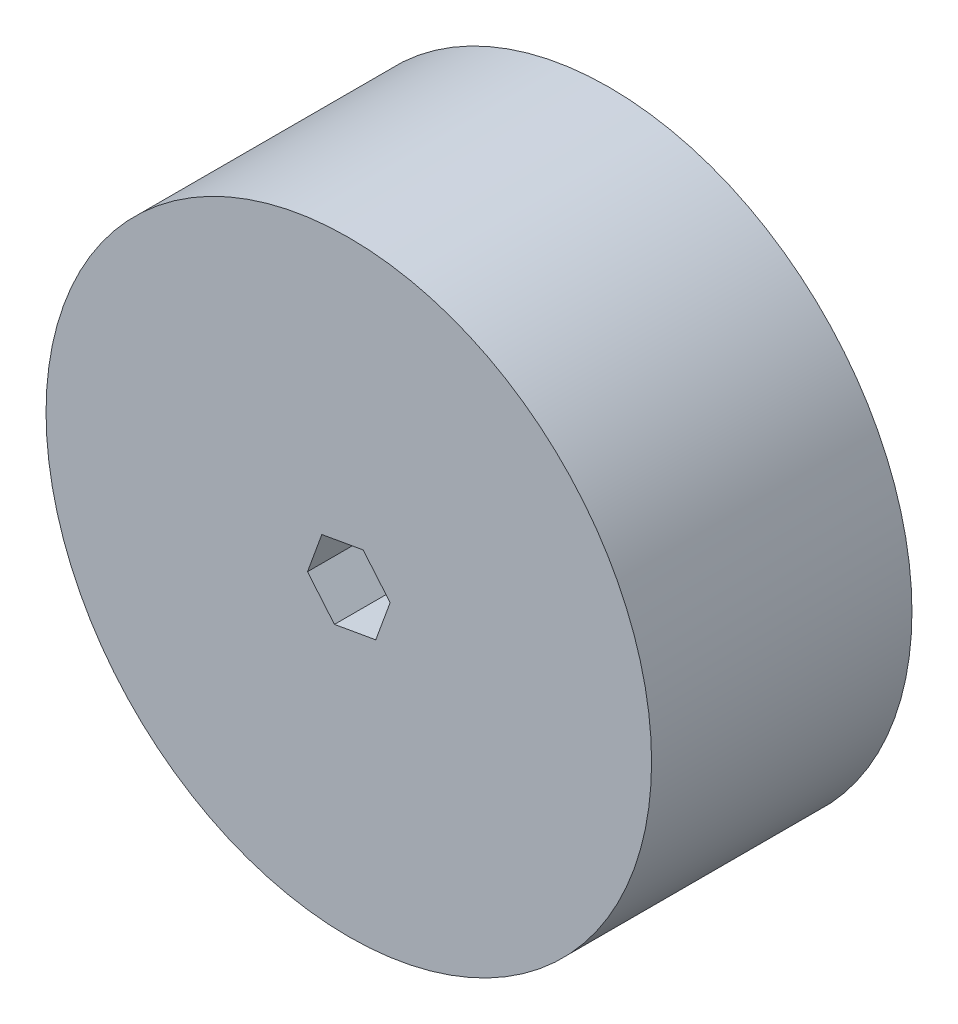
ISO-10303-21;
HEADER;
FILE_DESCRIPTION(('STEP AP214'),'2;1');
FILE_NAME('part.step','',(''),(''),'','','');
FILE_SCHEMA(('AUTOMOTIVE_DESIGN { 1 0 10303 214 1 1 1 1 }'));
ENDSEC;
DATA;
#1=APPLICATION_CONTEXT('core data for automotive mechanical design processes');
#2=APPLICATION_PROTOCOL_DEFINITION('international standard','automotive_design',2000,#1);
#3=PRODUCT_CONTEXT('',#1,'mechanical');
#4=PRODUCT('Part','Part','',(#3));
#5=PRODUCT_RELATED_PRODUCT_CATEGORY('part','',(#4));
#6=PRODUCT_DEFINITION_FORMATION('','',#4);
#7=PRODUCT_DEFINITION_CONTEXT('part definition',#1,'design');
#8=PRODUCT_DEFINITION('design','',#6,#7);
#9=PRODUCT_DEFINITION_SHAPE('','',#8);
#10=(LENGTH_UNIT() NAMED_UNIT(*) SI_UNIT(.MILLI.,.METRE.));
#11=(NAMED_UNIT(*) PLANE_ANGLE_UNIT() SI_UNIT($,.RADIAN.));
#12=(NAMED_UNIT(*) SI_UNIT($,.STERADIAN.) SOLID_ANGLE_UNIT());
#13=UNCERTAINTY_MEASURE_WITH_UNIT(LENGTH_MEASURE(1.E-05),#10,'distance_accuracy_value','');
#14=(GEOMETRIC_REPRESENTATION_CONTEXT(3) GLOBAL_UNCERTAINTY_ASSIGNED_CONTEXT((#13)) GLOBAL_UNIT_ASSIGNED_CONTEXT((#10,
#11,#12)) REPRESENTATION_CONTEXT('',''));
#15=CARTESIAN_POINT('',(0.,0.,0.));
#16=DIRECTION('',(0.,0.,1.));
#17=DIRECTION('',(1.,0.,0.));
#18=AXIS2_PLACEMENT_3D('',#15,#16,#17);
#19=CARTESIAN_POINT('',(0.,0.,43.));
#20=DIRECTION('',(0.,0.,-1.));
#21=DIRECTION('',(-1.,0.,0.));
#22=AXIS2_PLACEMENT_3D('',#19,#20,#21);
#23=CYLINDRICAL_SURFACE('',#22,50.);
#24=CARTESIAN_POINT('',(0.,0.,43.));
#25=DIRECTION('',(0.,0.,1.));
#26=DIRECTION('',(1.,0.,0.));
#27=AXIS2_PLACEMENT_3D('',#24,#25,#26);
#28=CIRCLE('',#27,50.);
#29=CARTESIAN_POINT('',(50.,0.,43.));
#30=VERTEX_POINT('',#29);
#31=EDGE_CURVE('E11',#30,#30,#28,.T.);
#32=ORIENTED_EDGE('',*,*,#31,.F.);
#33=EDGE_LOOP('',(#32));
#34=FACE_BOUND('',#33,.T.);
#35=CARTESIAN_POINT('',(0.,0.,0.));
#36=DIRECTION('',(0.,0.,1.));
#37=DIRECTION('',(1.,0.,0.));
#38=AXIS2_PLACEMENT_3D('',#35,#36,#37);
#39=CIRCLE('',#38,50.);
#40=CARTESIAN_POINT('',(50.,0.,0.));
#41=VERTEX_POINT('',#40);
#42=EDGE_CURVE('E43',#41,#41,#39,.T.);
#43=ORIENTED_EDGE('',*,*,#42,.T.);
#44=EDGE_LOOP('',(#43));
#45=FACE_BOUND('',#44,.T.);
#46=ADVANCED_FACE('F40',(#34,#45),#23,.T.);
#47=CARTESIAN_POINT('',(0.,0.,43.));
#48=DIRECTION('',(0.,0.,1.));
#49=DIRECTION('',(1.,0.,0.));
#50=AXIS2_PLACEMENT_3D('',#47,#48,#49);
#51=PLANE('',#50);
#52=DIRECTION('',(0.984815151014338,0.173606216284462,0.));
#53=VECTOR('',#52,1.);
#54=CARTESIAN_POINT('',(-2.36986245753413,-6.51028048031498,43.));
#55=LINE('',#54,#53);
#56=CARTESIAN_POINT('',(-2.36986245753413,-6.51028048031498,43.));
#57=VERTEX_POINT('',#56);
#58=CARTESIAN_POINT('',(4.45313705294767,-5.30750133185707,43.));
#59=VERTEX_POINT('',#58);
#60=EDGE_CURVE('E55',#57,#59,#55,.T.);
#61=ORIENTED_EDGE('',*,*,#60,.F.);
#62=DIRECTION('',(0.642754969064408,-0.766071830667994,0.));
#63=VECTOR('',#62,1.);
#64=CARTESIAN_POINT('',(-6.8229995104818,-1.20277914845791,43.));
#65=LINE('',#64,#63);
#66=CARTESIAN_POINT('',(-6.8229995104818,-1.20277914845791,43.));
#67=VERTEX_POINT('',#66);
#68=EDGE_CURVE('E148',#67,#57,#65,.T.);
#69=ORIENTED_EDGE('',*,*,#68,.F.);
#70=DIRECTION('',(-0.342060181949929,-0.939678046952455,0.));
#71=VECTOR('',#70,1.);
#72=CARTESIAN_POINT('',(-4.45313705294767,5.30750133185707,43.));
#73=LINE('',#72,#71);
#74=CARTESIAN_POINT('',(-4.45313705294767,5.30750133185707,43.));
#75=VERTEX_POINT('',#74);
#76=EDGE_CURVE('E145',#75,#67,#73,.T.);
#77=ORIENTED_EDGE('',*,*,#76,.F.);
#78=DIRECTION('',(-0.984815151014338,-0.173606216284462,0.));
#79=VECTOR('',#78,1.);
#80=CARTESIAN_POINT('',(2.36986245753413,6.51028048031498,43.));
#81=LINE('',#80,#79);
#82=CARTESIAN_POINT('',(2.36986245753413,6.51028048031498,43.));
#83=VERTEX_POINT('',#82);
#84=EDGE_CURVE('E103',#83,#75,#81,.T.);
#85=ORIENTED_EDGE('',*,*,#84,.F.);
#86=DIRECTION('',(-0.642754969064408,0.766071830667994,0.));
#87=VECTOR('',#86,1.);
#88=CARTESIAN_POINT('',(6.8229995104818,1.20277914845791,43.));
#89=LINE('',#88,#87);
#90=CARTESIAN_POINT('',(6.8229995104818,1.20277914845791,43.));
#91=VERTEX_POINT('',#90);
#92=EDGE_CURVE('E139',#91,#83,#89,.T.);
#93=ORIENTED_EDGE('',*,*,#92,.F.);
#94=DIRECTION('',(0.342060181949929,0.939678046952456,0.));
#95=VECTOR('',#94,1.);
#96=CARTESIAN_POINT('',(4.45313705294767,-5.30750133185707,43.));
#97=LINE('',#96,#95);
#98=EDGE_CURVE('E135',#59,#91,#97,.T.);
#99=ORIENTED_EDGE('',*,*,#98,.F.);
#100=EDGE_LOOP('',(#61,#69,#77,#85,#93,#99));
#101=FACE_BOUND('',#100,.T.);
#102=ORIENTED_EDGE('',*,*,#31,.T.);
#103=EDGE_LOOP('',(#102));
#104=FACE_BOUND('',#103,.T.);
#105=ADVANCED_FACE('F167',(#101,#104),#51,.T.);
#106=CARTESIAN_POINT('',(0.,0.,0.));
#107=DIRECTION('',(0.,0.,1.));
#108=DIRECTION('',(1.,0.,0.));
#109=AXIS2_PLACEMENT_3D('',#106,#107,#108);
#110=PLANE('',#109);
#111=ORIENTED_EDGE('',*,*,#42,.F.);
#112=EDGE_LOOP('',(#111));
#113=FACE_BOUND('',#112,.T.);
#114=ADVANCED_FACE('F178',(#113),#110,.F.);
#115=CARTESIAN_POINT('',(-2.36986245753413,-6.51028048031498,18.));
#116=DIRECTION('',(0.173606216284462,-0.984815151014338,0.));
#117=DIRECTION('',(0.984815151014338,0.173606216284462,0.));
#118=AXIS2_PLACEMENT_3D('',#115,#116,#117);
#119=PLANE('',#118);
#120=ORIENTED_EDGE('',*,*,#60,.T.);
#121=DIRECTION('',(0.,0.,1.));
#122=VECTOR('',#121,1.);
#123=CARTESIAN_POINT('',(4.45313705294767,-5.30750133185707,18.));
#124=LINE('',#123,#122);
#125=CARTESIAN_POINT('',(4.45313705294767,-5.30750133185707,18.));
#126=VERTEX_POINT('',#125);
#127=EDGE_CURVE('E85',#126,#59,#124,.T.);
#128=ORIENTED_EDGE('',*,*,#127,.F.);
#129=DIRECTION('',(0.984815151014338,0.173606216284462,0.));
#130=VECTOR('',#129,1.);
#131=CARTESIAN_POINT('',(-2.36986245753413,-6.51028048031498,18.));
#132=LINE('',#131,#130);
#133=CARTESIAN_POINT('',(-2.36986245753413,-6.51028048031498,18.));
#134=VERTEX_POINT('',#133);
#135=EDGE_CURVE('E151',#134,#126,#132,.T.);
#136=ORIENTED_EDGE('',*,*,#135,.F.);
#137=DIRECTION('',(0.,0.,1.));
#138=VECTOR('',#137,1.);
#139=CARTESIAN_POINT('',(-2.36986245753413,-6.51028048031498,18.));
#140=LINE('',#139,#138);
#141=EDGE_CURVE('E63',#134,#57,#140,.T.);
#142=ORIENTED_EDGE('',*,*,#141,.T.);
#143=EDGE_LOOP('',(#120,#128,#136,#142));
#144=FACE_BOUND('',#143,.T.);
#145=ADVANCED_FACE('F175',(#144),#119,.F.);
#146=CARTESIAN_POINT('',(-6.8229995104818,-1.20277914845791,18.));
#147=DIRECTION('',(-0.766071830667994,-0.642754969064408,0.));
#148=DIRECTION('',(0.642754969064408,-0.766071830667994,0.));
#149=AXIS2_PLACEMENT_3D('',#146,#147,#148);
#150=PLANE('',#149);
#151=ORIENTED_EDGE('',*,*,#68,.T.);
#152=ORIENTED_EDGE('',*,*,#141,.F.);
#153=DIRECTION('',(0.642754969064408,-0.766071830667994,0.));
#154=VECTOR('',#153,1.);
#155=CARTESIAN_POINT('',(-6.8229995104818,-1.20277914845791,18.));
#156=LINE('',#155,#154);
#157=CARTESIAN_POINT('',(-6.8229995104818,-1.20277914845791,18.));
#158=VERTEX_POINT('',#157);
#159=EDGE_CURVE('E117',#158,#134,#156,.T.);
#160=ORIENTED_EDGE('',*,*,#159,.F.);
#161=DIRECTION('',(0.,0.,1.));
#162=VECTOR('',#161,1.);
#163=CARTESIAN_POINT('',(-6.8229995104818,-1.20277914845791,18.));
#164=LINE('',#163,#162);
#165=EDGE_CURVE('E108',#158,#67,#164,.T.);
#166=ORIENTED_EDGE('',*,*,#165,.T.);
#167=EDGE_LOOP('',(#151,#152,#160,#166));
#168=FACE_BOUND('',#167,.T.);
#169=ADVANCED_FACE('F177',(#168),#150,.F.);
#170=CARTESIAN_POINT('',(-4.45313705294767,5.30750133185707,18.));
#171=DIRECTION('',(-0.939678046952456,0.342060181949929,0.));
#172=DIRECTION('',(-0.342060181949929,-0.939678046952456,0.));
#173=AXIS2_PLACEMENT_3D('',#170,#171,#172);
#174=PLANE('',#173);
#175=ORIENTED_EDGE('',*,*,#76,.T.);
#176=ORIENTED_EDGE('',*,*,#165,.F.);
#177=DIRECTION('',(-0.342060181949929,-0.939678046952455,0.));
#178=VECTOR('',#177,1.);
#179=CARTESIAN_POINT('',(-4.45313705294767,5.30750133185707,18.));
#180=LINE('',#179,#178);
#181=CARTESIAN_POINT('',(-4.45313705294767,5.30750133185707,18.));
#182=VERTEX_POINT('',#181);
#183=EDGE_CURVE('E112',#182,#158,#180,.T.);
#184=ORIENTED_EDGE('',*,*,#183,.F.);
#185=DIRECTION('',(0.,0.,1.));
#186=VECTOR('',#185,1.);
#187=CARTESIAN_POINT('',(-4.45313705294767,5.30750133185707,18.));
#188=LINE('',#187,#186);
#189=EDGE_CURVE('E96',#182,#75,#188,.T.);
#190=ORIENTED_EDGE('',*,*,#189,.T.);
#191=EDGE_LOOP('',(#175,#176,#184,#190));
#192=FACE_BOUND('',#191,.T.);
#193=ADVANCED_FACE('F113',(#192),#174,.F.);
#194=CARTESIAN_POINT('',(2.36986245753413,6.51028048031498,18.));
#195=DIRECTION('',(-0.173606216284462,0.984815151014338,0.));
#196=DIRECTION('',(-0.984815151014338,-0.173606216284462,0.));
#197=AXIS2_PLACEMENT_3D('',#194,#195,#196);
#198=PLANE('',#197);
#199=ORIENTED_EDGE('',*,*,#84,.T.);
#200=ORIENTED_EDGE('',*,*,#189,.F.);
#201=DIRECTION('',(-0.984815151014338,-0.173606216284462,0.));
#202=VECTOR('',#201,1.);
#203=CARTESIAN_POINT('',(2.36986245753413,6.51028048031498,18.));
#204=LINE('',#203,#202);
#205=CARTESIAN_POINT('',(2.36986245753413,6.51028048031498,18.));
#206=VERTEX_POINT('',#205);
#207=EDGE_CURVE('E100',#206,#182,#204,.T.);
#208=ORIENTED_EDGE('',*,*,#207,.F.);
#209=DIRECTION('',(0.,0.,1.));
#210=VECTOR('',#209,1.);
#211=CARTESIAN_POINT('',(2.36986245753413,6.51028048031498,18.));
#212=LINE('',#211,#210);
#213=EDGE_CURVE('E109',#206,#83,#212,.T.);
#214=ORIENTED_EDGE('',*,*,#213,.T.);
#215=EDGE_LOOP('',(#199,#200,#208,#214));
#216=FACE_BOUND('',#215,.T.);
#217=ADVANCED_FACE('F98',(#216),#198,.F.);
#218=CARTESIAN_POINT('',(6.8229995104818,1.20277914845791,18.));
#219=DIRECTION('',(0.766071830667994,0.642754969064408,0.));
#220=DIRECTION('',(-0.642754969064408,0.766071830667994,0.));
#221=AXIS2_PLACEMENT_3D('',#218,#219,#220);
#222=PLANE('',#221);
#223=ORIENTED_EDGE('',*,*,#92,.T.);
#224=ORIENTED_EDGE('',*,*,#213,.F.);
#225=DIRECTION('',(-0.642754969064408,0.766071830667994,0.));
#226=VECTOR('',#225,1.);
#227=CARTESIAN_POINT('',(6.8229995104818,1.20277914845791,18.));
#228=LINE('',#227,#226);
#229=CARTESIAN_POINT('',(6.8229995104818,1.20277914845791,18.));
#230=VERTEX_POINT('',#229);
#231=EDGE_CURVE('E123',#230,#206,#228,.T.);
#232=ORIENTED_EDGE('',*,*,#231,.F.);
#233=DIRECTION('',(0.,0.,1.));
#234=VECTOR('',#233,1.);
#235=CARTESIAN_POINT('',(6.8229995104818,1.20277914845791,18.));
#236=LINE('',#235,#234);
#237=EDGE_CURVE('E158',#230,#91,#236,.T.);
#238=ORIENTED_EDGE('',*,*,#237,.T.);
#239=EDGE_LOOP('',(#223,#224,#232,#238));
#240=FACE_BOUND('',#239,.T.);
#241=ADVANCED_FACE('F171',(#240),#222,.F.);
#242=CARTESIAN_POINT('',(4.45313705294767,-5.30750133185707,18.));
#243=DIRECTION('',(0.939678046952455,-0.342060181949929,0.));
#244=DIRECTION('',(0.342060181949929,0.939678046952456,0.));
#245=AXIS2_PLACEMENT_3D('',#242,#243,#244);
#246=PLANE('',#245);
#247=ORIENTED_EDGE('',*,*,#98,.T.);
#248=ORIENTED_EDGE('',*,*,#237,.F.);
#249=DIRECTION('',(0.342060181949929,0.939678046952456,0.));
#250=VECTOR('',#249,1.);
#251=CARTESIAN_POINT('',(4.45313705294767,-5.30750133185707,18.));
#252=LINE('',#251,#250);
#253=EDGE_CURVE('E127',#126,#230,#252,.T.);
#254=ORIENTED_EDGE('',*,*,#253,.F.);
#255=ORIENTED_EDGE('',*,*,#127,.T.);
#256=EDGE_LOOP('',(#247,#248,#254,#255));
#257=FACE_BOUND('',#256,.T.);
#258=ADVANCED_FACE('F164',(#257),#246,.F.);
#259=CARTESIAN_POINT('',(0.,0.,18.));
#260=DIRECTION('',(0.,0.,1.));
#261=DIRECTION('',(1.,0.,0.));
#262=AXIS2_PLACEMENT_3D('',#259,#260,#261);
#263=PLANE('',#262);
#264=ORIENTED_EDGE('',*,*,#135,.T.);
#265=ORIENTED_EDGE('',*,*,#253,.T.);
#266=ORIENTED_EDGE('',*,*,#231,.T.);
#267=ORIENTED_EDGE('',*,*,#207,.T.);
#268=ORIENTED_EDGE('',*,*,#183,.T.);
#269=ORIENTED_EDGE('',*,*,#159,.T.);
#270=EDGE_LOOP('',(#264,#265,#266,#267,#268,#269));
#271=FACE_BOUND('',#270,.T.);
#272=ADVANCED_FACE('F120',(#271),#263,.T.);
#273=CLOSED_SHELL('',(#46,#105,#114,#145,#169,#193,#217,#241,#258,#272));
#274=MANIFOLD_SOLID_BREP('B2',#273);
#275=ADVANCED_BREP_SHAPE_REPRESENTATION('',(#18,#274),#14);
#276=SHAPE_DEFINITION_REPRESENTATION(#9,#275);
ENDSEC;
END-ISO-10303-21;
